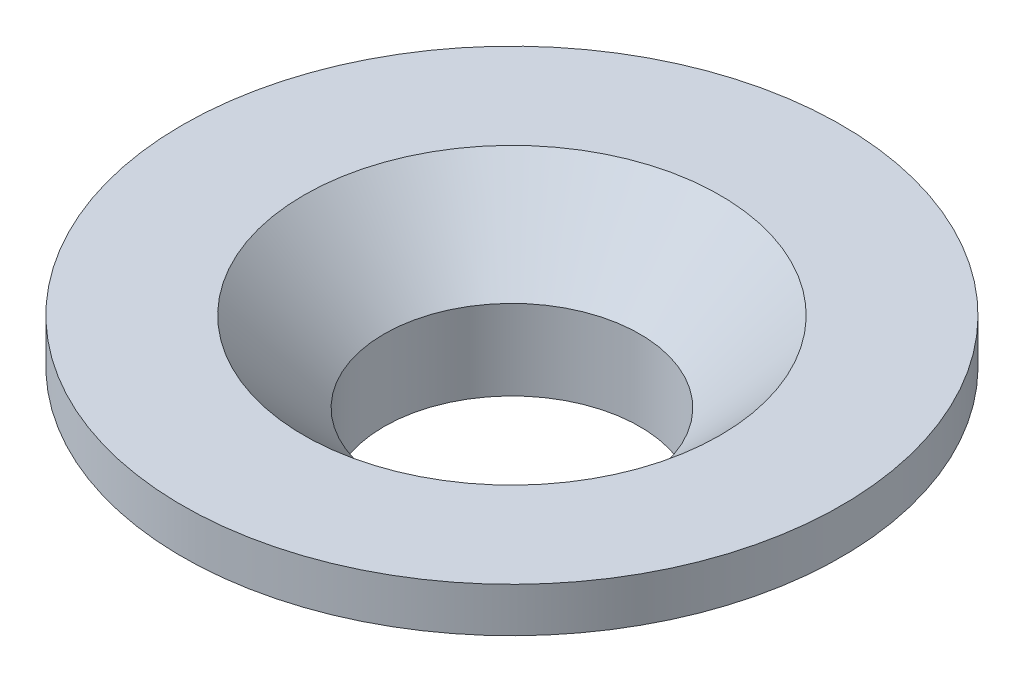
ISO-10303-21;
HEADER;
FILE_DESCRIPTION(('STEP AP214'),'2;1');
FILE_NAME('part.step','',(''),(''),'','','');
FILE_SCHEMA(('AUTOMOTIVE_DESIGN { 1 0 10303 214 1 1 1 1 }'));
ENDSEC;
DATA;
#1=APPLICATION_CONTEXT('core data for automotive mechanical design processes');
#2=APPLICATION_PROTOCOL_DEFINITION('international standard','automotive_design',2000,#1);
#3=PRODUCT_CONTEXT('',#1,'mechanical');
#4=PRODUCT('Part','Part','',(#3));
#5=PRODUCT_RELATED_PRODUCT_CATEGORY('part','',(#4));
#6=PRODUCT_DEFINITION_FORMATION('','',#4);
#7=PRODUCT_DEFINITION_CONTEXT('part definition',#1,'design');
#8=PRODUCT_DEFINITION('design','',#6,#7);
#9=PRODUCT_DEFINITION_SHAPE('','',#8);
#10=(LENGTH_UNIT() NAMED_UNIT(*) SI_UNIT(.MILLI.,.METRE.));
#11=(NAMED_UNIT(*) PLANE_ANGLE_UNIT() SI_UNIT($,.RADIAN.));
#12=(NAMED_UNIT(*) SI_UNIT($,.STERADIAN.) SOLID_ANGLE_UNIT());
#13=UNCERTAINTY_MEASURE_WITH_UNIT(LENGTH_MEASURE(1.E-05),#10,'distance_accuracy_value','');
#14=(GEOMETRIC_REPRESENTATION_CONTEXT(3) GLOBAL_UNCERTAINTY_ASSIGNED_CONTEXT((#13)) GLOBAL_UNIT_ASSIGNED_CONTEXT((#10,
#11,#12)) REPRESENTATION_CONTEXT('',''));
#15=CARTESIAN_POINT('',(0.,0.,0.));
#16=DIRECTION('',(0.,0.,1.));
#17=DIRECTION('',(1.,0.,0.));
#18=AXIS2_PLACEMENT_3D('',#15,#16,#17);
#19=CARTESIAN_POINT('',(-11.68,0.,0.));
#20=DIRECTION('',(0.,1.,0.));
#21=DIRECTION('',(-1.,0.,0.));
#22=AXIS2_PLACEMENT_3D('',#19,#20,#21);
#23=TOROIDAL_SURFACE('',#22,11.68,2.5);
#24=CARTESIAN_POINT('',(-11.68,0.,0.));
#25=DIRECTION('',(0.,1.,0.));
#26=DIRECTION('',(-1.,0.,0.));
#27=AXIS2_PLACEMENT_3D('',#24,#25,#26);
#28=CIRCLE('',#27,9.18);
#29=CARTESIAN_POINT('',(-20.86,0.,0.));
#30=VERTEX_POINT('',#29);
#31=EDGE_CURVE('E66',#30,#30,#28,.T.);
#32=ORIENTED_EDGE('',*,*,#31,.T.);
#33=EDGE_LOOP('',(#32));
#34=FACE_BOUND('',#33,.T.);
#35=CARTESIAN_POINT('',(-11.68,2.5,0.));
#36=DIRECTION('',(0.,1.,0.));
#37=DIRECTION('',(-1.,0.,0.));
#38=AXIS2_PLACEMENT_3D('',#35,#36,#37);
#39=CIRCLE('',#38,11.68);
#40=CARTESIAN_POINT('',(-23.36,2.5,0.));
#41=VERTEX_POINT('',#40);
#42=EDGE_CURVE('E10',#41,#41,#39,.T.);
#43=ORIENTED_EDGE('',*,*,#42,.F.);
#44=EDGE_LOOP('',(#43));
#45=FACE_BOUND('',#44,.T.);
#46=ADVANCED_FACE('F38',(#34,#45),#23,.F.);
#47=CARTESIAN_POINT('',(0.,2.5,0.));
#48=DIRECTION('',(0.,1.,0.));
#49=DIRECTION('',(-1.,0.,0.));
#50=AXIS2_PLACEMENT_3D('',#47,#48,#49);
#51=PLANE('',#50);
#52=CARTESIAN_POINT('',(-11.68,2.5,0.));
#53=DIRECTION('',(0.,1.,0.));
#54=DIRECTION('',(-1.,0.,0.));
#55=AXIS2_PLACEMENT_3D('',#52,#53,#54);
#56=CIRCLE('',#55,18.5);
#57=CARTESIAN_POINT('',(-30.18,2.49999999999999,0.));
#58=VERTEX_POINT('',#57);
#59=EDGE_CURVE('E44',#58,#58,#56,.T.);
#60=ORIENTED_EDGE('',*,*,#59,.F.);
#61=EDGE_LOOP('',(#60));
#62=FACE_BOUND('',#61,.T.);
#63=ORIENTED_EDGE('',*,*,#42,.T.);
#64=EDGE_LOOP('',(#63));
#65=FACE_BOUND('',#64,.T.);
#66=ADVANCED_FACE('F84',(#62,#65),#51,.F.);
#67=CARTESIAN_POINT('',(-11.68,6.13361587489452,0.));
#68=DIRECTION('',(0.,1.,0.));
#69=DIRECTION('',(-1.,0.,0.));
#70=AXIS2_PLACEMENT_3D('',#67,#68,#69);
#71=CYLINDRICAL_SURFACE('',#70,18.5);
#72=ORIENTED_EDGE('',*,*,#59,.T.);
#73=EDGE_LOOP('',(#72));
#74=FACE_BOUND('',#73,.T.);
#75=CARTESIAN_POINT('',(-11.68,5.,0.));
#76=DIRECTION('',(0.,1.,0.));
#77=DIRECTION('',(-1.,0.,0.));
#78=AXIS2_PLACEMENT_3D('',#75,#76,#77);
#79=CIRCLE('',#78,18.5);
#80=CARTESIAN_POINT('',(-30.18,4.99999999999999,0.));
#81=VERTEX_POINT('',#80);
#82=EDGE_CURVE('E48',#81,#81,#79,.T.);
#83=ORIENTED_EDGE('',*,*,#82,.F.);
#84=EDGE_LOOP('',(#83));
#85=FACE_BOUND('',#84,.T.);
#86=ADVANCED_FACE('F88',(#74,#85),#71,.T.);
#87=CARTESIAN_POINT('',(0.,5.,0.));
#88=DIRECTION('',(0.,1.,0.));
#89=DIRECTION('',(-1.,0.,0.));
#90=AXIS2_PLACEMENT_3D('',#87,#88,#89);
#91=PLANE('',#90);
#92=ORIENTED_EDGE('',*,*,#82,.T.);
#93=EDGE_LOOP('',(#92));
#94=FACE_BOUND('',#93,.T.);
#95=CARTESIAN_POINT('',(-11.68,5.,0.));
#96=DIRECTION('',(0.,1.,0.));
#97=DIRECTION('',(-1.,0.,0.));
#98=AXIS2_PLACEMENT_3D('',#95,#96,#97);
#99=CIRCLE('',#98,11.68);
#100=CARTESIAN_POINT('',(-23.36,5.,0.));
#101=VERTEX_POINT('',#100);
#102=EDGE_CURVE('E52',#101,#101,#99,.T.);
#103=ORIENTED_EDGE('',*,*,#102,.F.);
#104=EDGE_LOOP('',(#103));
#105=FACE_BOUND('',#104,.T.);
#106=ADVANCED_FACE('F93',(#94,#105),#91,.T.);
#107=CARTESIAN_POINT('',(-11.68,5.,0.));
#108=DIRECTION('',(0.,1.,0.));
#109=DIRECTION('',(-1.,0.,0.));
#110=AXIS2_PLACEMENT_3D('',#107,#108,#109);
#111=CONICAL_SURFACE('',#110,11.68,0.785398163397454);
#112=CARTESIAN_POINT('',(-11.68,0.500000000000041,0.));
#113=DIRECTION('',(0.,1.,0.));
#114=DIRECTION('',(-1.,0.,0.));
#115=AXIS2_PLACEMENT_3D('',#112,#113,#114);
#116=CIRCLE('',#115,7.18);
#117=CARTESIAN_POINT('',(-18.86,0.50000000000004,0.));
#118=VERTEX_POINT('',#117);
#119=EDGE_CURVE('E57',#118,#118,#116,.T.);
#120=ORIENTED_EDGE('',*,*,#119,.F.);
#121=EDGE_LOOP('',(#120));
#122=FACE_BOUND('',#121,.T.);
#123=ORIENTED_EDGE('',*,*,#102,.T.);
#124=EDGE_LOOP('',(#123));
#125=FACE_BOUND('',#124,.T.);
#126=ADVANCED_FACE('F98',(#122,#125),#111,.F.);
#127=CARTESIAN_POINT('',(-11.68,6.13361587489452,0.));
#128=DIRECTION('',(0.,1.,0.));
#129=DIRECTION('',(-1.,0.,0.));
#130=AXIS2_PLACEMENT_3D('',#127,#128,#129);
#131=CYLINDRICAL_SURFACE('',#130,7.18);
#132=CARTESIAN_POINT('',(-11.68,-4.,0.));
#133=DIRECTION('',(0.,1.,0.));
#134=DIRECTION('',(-1.,0.,0.));
#135=AXIS2_PLACEMENT_3D('',#132,#133,#134);
#136=CIRCLE('',#135,7.18);
#137=CARTESIAN_POINT('',(-18.86,-4.,0.));
#138=VERTEX_POINT('',#137);
#139=EDGE_CURVE('E60',#138,#138,#136,.T.);
#140=ORIENTED_EDGE('',*,*,#139,.F.);
#141=EDGE_LOOP('',(#140));
#142=FACE_BOUND('',#141,.T.);
#143=ORIENTED_EDGE('',*,*,#119,.T.);
#144=EDGE_LOOP('',(#143));
#145=FACE_BOUND('',#144,.T.);
#146=ADVANCED_FACE('F80',(#142,#145),#131,.F.);
#147=CARTESIAN_POINT('',(0.,-4.,0.));
#148=DIRECTION('',(0.,1.,0.));
#149=DIRECTION('',(-1.,0.,0.));
#150=AXIS2_PLACEMENT_3D('',#147,#148,#149);
#151=PLANE('',#150);
#152=CARTESIAN_POINT('',(-11.68,-4.,0.));
#153=DIRECTION('',(0.,1.,0.));
#154=DIRECTION('',(-1.,0.,0.));
#155=AXIS2_PLACEMENT_3D('',#152,#153,#154);
#156=CIRCLE('',#155,9.18);
#157=CARTESIAN_POINT('',(-20.86,-4.,0.));
#158=VERTEX_POINT('',#157);
#159=EDGE_CURVE('E63',#158,#158,#156,.T.);
#160=ORIENTED_EDGE('',*,*,#159,.F.);
#161=EDGE_LOOP('',(#160));
#162=FACE_BOUND('',#161,.T.);
#163=ORIENTED_EDGE('',*,*,#139,.T.);
#164=EDGE_LOOP('',(#163));
#165=FACE_BOUND('',#164,.T.);
#166=ADVANCED_FACE('F74',(#162,#165),#151,.F.);
#167=CARTESIAN_POINT('',(-11.68,6.13361587489452,0.));
#168=DIRECTION('',(0.,1.,0.));
#169=DIRECTION('',(-1.,0.,0.));
#170=AXIS2_PLACEMENT_3D('',#167,#168,#169);
#171=CYLINDRICAL_SURFACE('',#170,9.18);
#172=ORIENTED_EDGE('',*,*,#159,.T.);
#173=EDGE_LOOP('',(#172));
#174=FACE_BOUND('',#173,.T.);
#175=ORIENTED_EDGE('',*,*,#31,.F.);
#176=EDGE_LOOP('',(#175));
#177=FACE_BOUND('',#176,.T.);
#178=ADVANCED_FACE('F72',(#174,#177),#171,.T.);
#179=CLOSED_SHELL('',(#46,#66,#86,#106,#126,#146,#166,#178));
#180=MANIFOLD_SOLID_BREP('B2',#179);
#181=ADVANCED_BREP_SHAPE_REPRESENTATION('',(#18,#180),#14);
#182=SHAPE_DEFINITION_REPRESENTATION(#9,#181);
ENDSEC;
END-ISO-10303-21;
